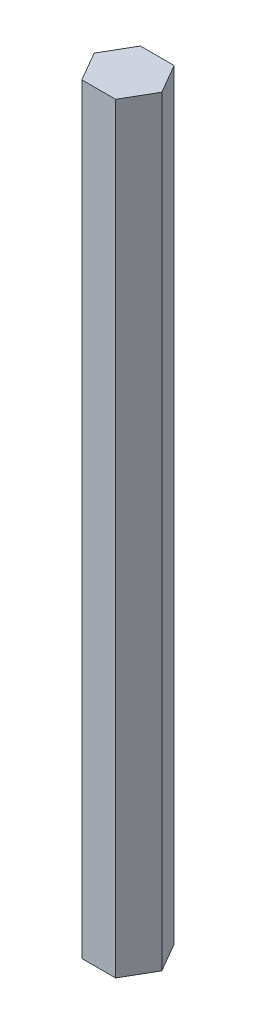
ISO-10303-21;
HEADER;
FILE_DESCRIPTION(('STEP AP214'),'2;1');
FILE_NAME('part.step','',(''),(''),'','','');
FILE_SCHEMA(('AUTOMOTIVE_DESIGN { 1 0 10303 214 1 1 1 1 }'));
ENDSEC;
DATA;
#1=APPLICATION_CONTEXT('core data for automotive mechanical design processes');
#2=APPLICATION_PROTOCOL_DEFINITION('international standard','automotive_design',2000,#1);
#3=PRODUCT_CONTEXT('',#1,'mechanical');
#4=PRODUCT('Part','Part','',(#3));
#5=PRODUCT_RELATED_PRODUCT_CATEGORY('part','',(#4));
#6=PRODUCT_DEFINITION_FORMATION('','',#4);
#7=PRODUCT_DEFINITION_CONTEXT('part definition',#1,'design');
#8=PRODUCT_DEFINITION('design','',#6,#7);
#9=PRODUCT_DEFINITION_SHAPE('','',#8);
#10=(LENGTH_UNIT() NAMED_UNIT(*) SI_UNIT(.MILLI.,.METRE.));
#11=(NAMED_UNIT(*) PLANE_ANGLE_UNIT() SI_UNIT($,.RADIAN.));
#12=(NAMED_UNIT(*) SI_UNIT($,.STERADIAN.) SOLID_ANGLE_UNIT());
#13=UNCERTAINTY_MEASURE_WITH_UNIT(LENGTH_MEASURE(1.E-05),#10,'distance_accuracy_value','');
#14=(GEOMETRIC_REPRESENTATION_CONTEXT(3) GLOBAL_UNCERTAINTY_ASSIGNED_CONTEXT((#13)) GLOBAL_UNIT_ASSIGNED_CONTEXT((#10,
#11,#12)) REPRESENTATION_CONTEXT('',''));
#15=CARTESIAN_POINT('',(0.,0.,0.));
#16=DIRECTION('',(0.,0.,1.));
#17=DIRECTION('',(1.,0.,0.));
#18=AXIS2_PLACEMENT_3D('',#15,#16,#17);
#19=CARTESIAN_POINT('',(7.33234841870824,165.1,0.));
#20=DIRECTION('',(-0.866025403784439,0.,0.5));
#21=DIRECTION('',(0.5,0.,0.866025403784439));
#22=AXIS2_PLACEMENT_3D('',#19,#20,#21);
#23=PLANE('',#22);
#24=DIRECTION('',(-0.5,0.,-0.866025403784439));
#25=VECTOR('',#24,1.);
#26=CARTESIAN_POINT('',(7.33234841870824,0.,0.));
#27=LINE('',#26,#25);
#28=CARTESIAN_POINT('',(7.33234841870824,0.,0.));
#29=VERTEX_POINT('',#28);
#30=CARTESIAN_POINT('',(3.66617420935411,0.,-6.35000000000002));
#31=VERTEX_POINT('',#30);
#32=EDGE_CURVE('E117',#29,#31,#27,.T.);
#33=ORIENTED_EDGE('',*,*,#32,.T.);
#34=DIRECTION('',(0.,-1.,0.));
#35=VECTOR('',#34,1.);
#36=CARTESIAN_POINT('',(3.66617420935411,165.1,-6.35000000000002));
#37=LINE('',#36,#35);
#38=CARTESIAN_POINT('',(3.66617420935411,165.1,-6.35000000000002));
#39=VERTEX_POINT('',#38);
#40=EDGE_CURVE('E11',#39,#31,#37,.T.);
#41=ORIENTED_EDGE('',*,*,#40,.F.);
#42=DIRECTION('',(-0.5,0.,-0.866025403784439));
#43=VECTOR('',#42,1.);
#44=CARTESIAN_POINT('',(7.33234841870824,165.1,0.));
#45=LINE('',#44,#43);
#46=CARTESIAN_POINT('',(7.33234841870824,165.1,0.));
#47=VERTEX_POINT('',#46);
#48=EDGE_CURVE('E127',#47,#39,#45,.T.);
#49=ORIENTED_EDGE('',*,*,#48,.F.);
#50=DIRECTION('',(0.,-1.,0.));
#51=VECTOR('',#50,1.);
#52=CARTESIAN_POINT('',(7.33234841870824,165.1,0.));
#53=LINE('',#52,#51);
#54=EDGE_CURVE('E113',#47,#29,#53,.T.);
#55=ORIENTED_EDGE('',*,*,#54,.T.);
#56=EDGE_LOOP('',(#33,#41,#49,#55));
#57=FACE_BOUND('',#56,.T.);
#58=ADVANCED_FACE('F33',(#57),#23,.F.);
#59=CARTESIAN_POINT('',(3.66617420935411,165.1,-6.35000000000002));
#60=DIRECTION('',(0.,0.,1.));
#61=DIRECTION('',(1.,0.,0.));
#62=AXIS2_PLACEMENT_3D('',#59,#60,#61);
#63=PLANE('',#62);
#64=DIRECTION('',(-1.,0.,0.));
#65=VECTOR('',#64,1.);
#66=CARTESIAN_POINT('',(3.66617420935411,0.,-6.35000000000002));
#67=LINE('',#66,#65);
#68=CARTESIAN_POINT('',(-3.66617420935413,0.,-6.35000000000002));
#69=VERTEX_POINT('',#68);
#70=EDGE_CURVE('E120',#31,#69,#67,.T.);
#71=ORIENTED_EDGE('',*,*,#70,.T.);
#72=DIRECTION('',(0.,-1.,0.));
#73=VECTOR('',#72,1.);
#74=CARTESIAN_POINT('',(-3.66617420935413,165.1,-6.35000000000002));
#75=LINE('',#74,#73);
#76=CARTESIAN_POINT('',(-3.66617420935413,165.1,-6.35000000000002));
#77=VERTEX_POINT('',#76);
#78=EDGE_CURVE('E41',#77,#69,#75,.T.);
#79=ORIENTED_EDGE('',*,*,#78,.F.);
#80=DIRECTION('',(-1.,0.,0.));
#81=VECTOR('',#80,1.);
#82=CARTESIAN_POINT('',(3.66617420935411,165.1,-6.35000000000002));
#83=LINE('',#82,#81);
#84=EDGE_CURVE('E86',#39,#77,#83,.T.);
#85=ORIENTED_EDGE('',*,*,#84,.F.);
#86=ORIENTED_EDGE('',*,*,#40,.T.);
#87=EDGE_LOOP('',(#71,#79,#85,#86));
#88=FACE_BOUND('',#87,.T.);
#89=ADVANCED_FACE('F151',(#88),#63,.F.);
#90=CARTESIAN_POINT('',(-3.66617420935413,165.1,-6.35000000000002));
#91=DIRECTION('',(0.866025403784439,0.,0.5));
#92=DIRECTION('',(0.5,0.,-0.866025403784439));
#93=AXIS2_PLACEMENT_3D('',#90,#91,#92);
#94=PLANE('',#93);
#95=DIRECTION('',(-0.5,0.,0.866025403784439));
#96=VECTOR('',#95,1.);
#97=CARTESIAN_POINT('',(-3.66617420935413,0.,-6.35000000000002));
#98=LINE('',#97,#96);
#99=CARTESIAN_POINT('',(-7.33234841870826,0.,0.));
#100=VERTEX_POINT('',#99);
#101=EDGE_CURVE('E122',#69,#100,#98,.T.);
#102=ORIENTED_EDGE('',*,*,#101,.T.);
#103=DIRECTION('',(0.,-1.,0.));
#104=VECTOR('',#103,1.);
#105=CARTESIAN_POINT('',(-7.33234841870826,165.1,0.));
#106=LINE('',#105,#104);
#107=CARTESIAN_POINT('',(-7.33234841870826,165.1,0.));
#108=VERTEX_POINT('',#107);
#109=EDGE_CURVE('E108',#108,#100,#106,.T.);
#110=ORIENTED_EDGE('',*,*,#109,.F.);
#111=DIRECTION('',(-0.5,0.,0.866025403784439));
#112=VECTOR('',#111,1.);
#113=CARTESIAN_POINT('',(-3.66617420935413,165.1,-6.35000000000002));
#114=LINE('',#113,#112);
#115=EDGE_CURVE('E99',#77,#108,#114,.T.);
#116=ORIENTED_EDGE('',*,*,#115,.F.);
#117=ORIENTED_EDGE('',*,*,#78,.T.);
#118=EDGE_LOOP('',(#102,#110,#116,#117));
#119=FACE_BOUND('',#118,.T.);
#120=ADVANCED_FACE('F133',(#119),#94,.F.);
#121=CARTESIAN_POINT('',(-7.33234841870826,165.1,0.));
#122=DIRECTION('',(0.866025403784439,0.,-0.5));
#123=DIRECTION('',(-0.5,0.,-0.866025403784439));
#124=AXIS2_PLACEMENT_3D('',#121,#122,#123);
#125=PLANE('',#124);
#126=DIRECTION('',(0.5,0.,0.866025403784439));
#127=VECTOR('',#126,1.);
#128=CARTESIAN_POINT('',(-7.33234841870826,0.,0.));
#129=LINE('',#128,#127);
#130=CARTESIAN_POINT('',(-3.66617420935413,0.,6.35000000000001));
#131=VERTEX_POINT('',#130);
#132=EDGE_CURVE('E107',#100,#131,#129,.T.);
#133=ORIENTED_EDGE('',*,*,#132,.T.);
#134=DIRECTION('',(0.,-1.,0.));
#135=VECTOR('',#134,1.);
#136=CARTESIAN_POINT('',(-3.66617420935413,165.1,6.35000000000001));
#137=LINE('',#136,#135);
#138=CARTESIAN_POINT('',(-3.66617420935413,165.1,6.35000000000001));
#139=VERTEX_POINT('',#138);
#140=EDGE_CURVE('E104',#139,#131,#137,.T.);
#141=ORIENTED_EDGE('',*,*,#140,.F.);
#142=DIRECTION('',(0.5,0.,0.866025403784439));
#143=VECTOR('',#142,1.);
#144=CARTESIAN_POINT('',(-7.33234841870826,165.1,0.));
#145=LINE('',#144,#143);
#146=EDGE_CURVE('E93',#108,#139,#145,.T.);
#147=ORIENTED_EDGE('',*,*,#146,.F.);
#148=ORIENTED_EDGE('',*,*,#109,.T.);
#149=EDGE_LOOP('',(#133,#141,#147,#148));
#150=FACE_BOUND('',#149,.T.);
#151=ADVANCED_FACE('F105',(#150),#125,.F.);
#152=CARTESIAN_POINT('',(-3.66617420935413,165.1,6.35000000000001));
#153=DIRECTION('',(0.,0.,-1.));
#154=DIRECTION('',(-1.,0.,0.));
#155=AXIS2_PLACEMENT_3D('',#152,#153,#154);
#156=PLANE('',#155);
#157=DIRECTION('',(1.,0.,0.));
#158=VECTOR('',#157,1.);
#159=CARTESIAN_POINT('',(-3.66617420935413,0.,6.35000000000001));
#160=LINE('',#159,#158);
#161=CARTESIAN_POINT('',(3.66617420935412,0.,6.35000000000001));
#162=VERTEX_POINT('',#161);
#163=EDGE_CURVE('E72',#131,#162,#160,.T.);
#164=ORIENTED_EDGE('',*,*,#163,.T.);
#165=DIRECTION('',(0.,-1.,0.));
#166=VECTOR('',#165,1.);
#167=CARTESIAN_POINT('',(3.66617420935412,165.1,6.35000000000001));
#168=LINE('',#167,#166);
#169=CARTESIAN_POINT('',(3.66617420935412,165.1,6.35000000000001));
#170=VERTEX_POINT('',#169);
#171=EDGE_CURVE('E109',#170,#162,#168,.T.);
#172=ORIENTED_EDGE('',*,*,#171,.F.);
#173=DIRECTION('',(1.,0.,0.));
#174=VECTOR('',#173,1.);
#175=CARTESIAN_POINT('',(-3.66617420935413,165.1,6.35000000000001));
#176=LINE('',#175,#174);
#177=EDGE_CURVE('E97',#139,#170,#176,.T.);
#178=ORIENTED_EDGE('',*,*,#177,.F.);
#179=ORIENTED_EDGE('',*,*,#140,.T.);
#180=EDGE_LOOP('',(#164,#172,#178,#179));
#181=FACE_BOUND('',#180,.T.);
#182=ADVANCED_FACE('F111',(#181),#156,.F.);
#183=CARTESIAN_POINT('',(3.66617420935412,165.1,6.35000000000001));
#184=DIRECTION('',(-0.866025403784439,0.,-0.5));
#185=DIRECTION('',(-0.5,0.,0.866025403784439));
#186=AXIS2_PLACEMENT_3D('',#183,#184,#185);
#187=PLANE('',#186);
#188=DIRECTION('',(0.5,0.,-0.866025403784439));
#189=VECTOR('',#188,1.);
#190=CARTESIAN_POINT('',(3.66617420935412,0.,6.35000000000001));
#191=LINE('',#190,#189);
#192=EDGE_CURVE('E78',#162,#29,#191,.T.);
#193=ORIENTED_EDGE('',*,*,#192,.T.);
#194=ORIENTED_EDGE('',*,*,#54,.F.);
#195=DIRECTION('',(0.5,0.,-0.866025403784439));
#196=VECTOR('',#195,1.);
#197=CARTESIAN_POINT('',(3.66617420935412,165.1,6.35000000000001));
#198=LINE('',#197,#196);
#199=EDGE_CURVE('E49',#170,#47,#198,.T.);
#200=ORIENTED_EDGE('',*,*,#199,.F.);
#201=ORIENTED_EDGE('',*,*,#171,.T.);
#202=EDGE_LOOP('',(#193,#194,#200,#201));
#203=FACE_BOUND('',#202,.T.);
#204=ADVANCED_FACE('F140',(#203),#187,.F.);
#205=CARTESIAN_POINT('',(0.,165.1,0.));
#206=DIRECTION('',(0.,1.,0.));
#207=DIRECTION('',(0.,0.,1.));
#208=AXIS2_PLACEMENT_3D('',#205,#206,#207);
#209=PLANE('',#208);
#210=ORIENTED_EDGE('',*,*,#48,.T.);
#211=ORIENTED_EDGE('',*,*,#84,.T.);
#212=ORIENTED_EDGE('',*,*,#115,.T.);
#213=ORIENTED_EDGE('',*,*,#146,.T.);
#214=ORIENTED_EDGE('',*,*,#177,.T.);
#215=ORIENTED_EDGE('',*,*,#199,.T.);
#216=EDGE_LOOP('',(#210,#211,#212,#213,#214,#215));
#217=FACE_BOUND('',#216,.T.);
#218=ADVANCED_FACE('F95',(#217),#209,.T.);
#219=CARTESIAN_POINT('',(0.,0.,0.));
#220=DIRECTION('',(0.,1.,0.));
#221=DIRECTION('',(0.,0.,1.));
#222=AXIS2_PLACEMENT_3D('',#219,#220,#221);
#223=PLANE('',#222);
#224=ORIENTED_EDGE('',*,*,#32,.F.);
#225=ORIENTED_EDGE('',*,*,#192,.F.);
#226=ORIENTED_EDGE('',*,*,#163,.F.);
#227=ORIENTED_EDGE('',*,*,#132,.F.);
#228=ORIENTED_EDGE('',*,*,#101,.F.);
#229=ORIENTED_EDGE('',*,*,#70,.F.);
#230=EDGE_LOOP('',(#224,#225,#226,#227,#228,#229));
#231=FACE_BOUND('',#230,.T.);
#232=ADVANCED_FACE('F136',(#231),#223,.F.);
#233=CLOSED_SHELL('',(#58,#89,#120,#151,#182,#204,#218,#232));
#234=MANIFOLD_SOLID_BREP('B2',#233);
#235=ADVANCED_BREP_SHAPE_REPRESENTATION('',(#18,#234),#14);
#236=SHAPE_DEFINITION_REPRESENTATION(#9,#235);
ENDSEC;
END-ISO-10303-21;
